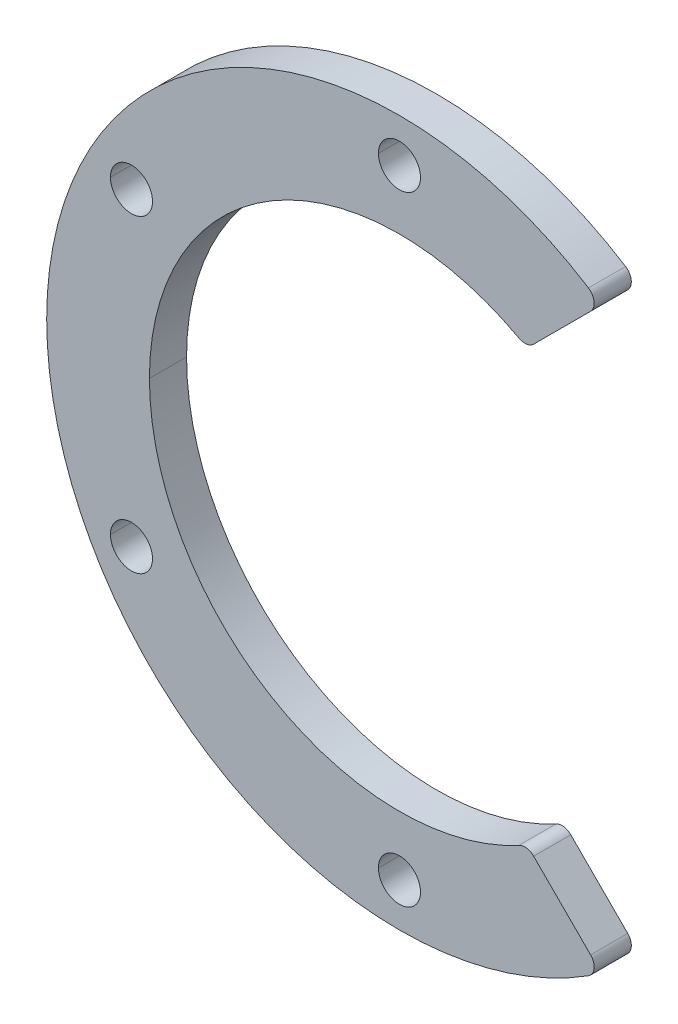
ISO-10303-21;
HEADER;
FILE_DESCRIPTION(('STEP AP214'),'2;1');
FILE_NAME('part.step','',(''),(''),'','','');
FILE_SCHEMA(('AUTOMOTIVE_DESIGN { 1 0 10303 214 1 1 1 1 }'));
ENDSEC;
DATA;
#1=APPLICATION_CONTEXT('core data for automotive mechanical design processes');
#2=APPLICATION_PROTOCOL_DEFINITION('international standard','automotive_design',2000,#1);
#3=PRODUCT_CONTEXT('',#1,'mechanical');
#4=PRODUCT('Part','Part','',(#3));
#5=PRODUCT_RELATED_PRODUCT_CATEGORY('part','',(#4));
#6=PRODUCT_DEFINITION_FORMATION('','',#4);
#7=PRODUCT_DEFINITION_CONTEXT('part definition',#1,'design');
#8=PRODUCT_DEFINITION('design','',#6,#7);
#9=PRODUCT_DEFINITION_SHAPE('','',#8);
#10=(LENGTH_UNIT() NAMED_UNIT(*) SI_UNIT(.MILLI.,.METRE.));
#11=(NAMED_UNIT(*) PLANE_ANGLE_UNIT() SI_UNIT($,.RADIAN.));
#12=(NAMED_UNIT(*) SI_UNIT($,.STERADIAN.) SOLID_ANGLE_UNIT());
#13=UNCERTAINTY_MEASURE_WITH_UNIT(LENGTH_MEASURE(1.E-05),#10,'distance_accuracy_value','');
#14=(GEOMETRIC_REPRESENTATION_CONTEXT(3) GLOBAL_UNCERTAINTY_ASSIGNED_CONTEXT((#13)) GLOBAL_UNIT_ASSIGNED_CONTEXT((#10,
#11,#12)) REPRESENTATION_CONTEXT('',''));
#15=CARTESIAN_POINT('',(0.,0.,0.));
#16=DIRECTION('',(0.,0.,1.));
#17=DIRECTION('',(1.,0.,0.));
#18=AXIS2_PLACEMENT_3D('',#15,#16,#17);
#19=CARTESIAN_POINT('',(10.1351199173702,-18.6204012916088,3.));
#20=DIRECTION('',(0.,0.,-1.));
#21=DIRECTION('',(-1.,0.,0.));
#22=AXIS2_PLACEMENT_3D('',#19,#20,#21);
#23=CYLINDRICAL_SURFACE('',#22,1.);
#24=CARTESIAN_POINT('',(10.1351199173702,-18.6204012916088,3.));
#25=DIRECTION('',(0.,0.,1.));
#26=DIRECTION('',(1.,0.,0.));
#27=AXIS2_PLACEMENT_3D('',#24,#25,#26);
#28=CIRCLE('',#27,1.);
#29=CARTESIAN_POINT('',(10.8422266985567,-17.9132945104223,3.));
#30=VERTEX_POINT('',#29);
#31=CARTESIAN_POINT('',(9.65704822315463,-17.7420804759669,3.));
#32=VERTEX_POINT('',#31);
#33=EDGE_CURVE('E219',#30,#32,#28,.T.);
#34=ORIENTED_EDGE('',*,*,#33,.F.);
#35=DIRECTION('',(0.,0.,1.));
#36=VECTOR('',#35,1.);
#37=CARTESIAN_POINT('',(10.8422266985567,-17.9132945104223,3.));
#38=LINE('',#37,#36);
#39=CARTESIAN_POINT('',(10.8422266985567,-17.9132945104223,0.));
#40=VERTEX_POINT('',#39);
#41=EDGE_CURVE('E195',#40,#30,#38,.T.);
#42=ORIENTED_EDGE('',*,*,#41,.F.);
#43=CARTESIAN_POINT('',(10.1351199173702,-18.6204012916088,0.));
#44=DIRECTION('',(0.,0.,-1.));
#45=DIRECTION('',(1.,0.,0.));
#46=AXIS2_PLACEMENT_3D('',#43,#44,#45);
#47=CIRCLE('',#46,1.);
#48=CARTESIAN_POINT('',(9.65704822315463,-17.7420804759669,0.));
#49=VERTEX_POINT('',#48);
#50=EDGE_CURVE('E23',#49,#40,#47,.T.);
#51=ORIENTED_EDGE('',*,*,#50,.F.);
#52=DIRECTION('',(0.,0.,-1.));
#53=VECTOR('',#52,1.);
#54=CARTESIAN_POINT('',(9.65704822315463,-17.7420804759669,3.));
#55=LINE('',#54,#53);
#56=EDGE_CURVE('E317',#32,#49,#55,.T.);
#57=ORIENTED_EDGE('',*,*,#56,.F.);
#58=EDGE_LOOP('',(#34,#42,#51,#57));
#59=FACE_BOUND('',#58,.T.);
#60=ADVANCED_FACE('F15',(#59),#23,.T.);
#61=CARTESIAN_POINT('',(14.734319027229,-23.2196004014676,3.));
#62=DIRECTION('',(0.,0.,-1.));
#63=DIRECTION('',(-1.,0.,0.));
#64=AXIS2_PLACEMENT_3D('',#61,#62,#63);
#65=CYLINDRICAL_SURFACE('',#64,1.);
#66=CARTESIAN_POINT('',(14.734319027229,-23.2196004014676,3.));
#67=DIRECTION('',(0.,0.,1.));
#68=DIRECTION('',(1.,0.,0.));
#69=AXIS2_PLACEMENT_3D('',#66,#67,#68);
#70=CIRCLE('',#69,1.);
#71=CARTESIAN_POINT('',(15.270112446401,-24.0639495069756,3.));
#72=VERTEX_POINT('',#71);
#73=CARTESIAN_POINT('',(15.4414258084156,-22.5124936202811,3.));
#74=VERTEX_POINT('',#73);
#75=EDGE_CURVE('E359',#72,#74,#70,.T.);
#76=ORIENTED_EDGE('',*,*,#75,.F.);
#77=DIRECTION('',(0.,0.,1.));
#78=VECTOR('',#77,1.);
#79=CARTESIAN_POINT('',(15.270112446401,-24.0639495069756,3.));
#80=LINE('',#79,#78);
#81=CARTESIAN_POINT('',(15.270112446401,-24.0639495069756,0.));
#82=VERTEX_POINT('',#81);
#83=EDGE_CURVE('E279',#82,#72,#80,.T.);
#84=ORIENTED_EDGE('',*,*,#83,.F.);
#85=CARTESIAN_POINT('',(14.734319027229,-23.2196004014676,0.));
#86=DIRECTION('',(0.,0.,-1.));
#87=DIRECTION('',(1.,0.,0.));
#88=AXIS2_PLACEMENT_3D('',#85,#86,#87);
#89=CIRCLE('',#88,1.);
#90=CARTESIAN_POINT('',(15.4414258084156,-22.5124936202811,0.));
#91=VERTEX_POINT('',#90);
#92=EDGE_CURVE('E9',#91,#82,#89,.T.);
#93=ORIENTED_EDGE('',*,*,#92,.F.);
#94=DIRECTION('',(0.,0.,-1.));
#95=VECTOR('',#94,1.);
#96=CARTESIAN_POINT('',(15.4414258084156,-22.5124936202811,3.));
#97=LINE('',#96,#95);
#98=EDGE_CURVE('E365',#74,#91,#97,.T.);
#99=ORIENTED_EDGE('',*,*,#98,.F.);
#100=EDGE_LOOP('',(#76,#84,#93,#99));
#101=FACE_BOUND('',#100,.T.);
#102=ADVANCED_FACE('F404',(#101),#65,.T.);
#103=CARTESIAN_POINT('',(10.1351199173702,18.6204012916088,3.));
#104=DIRECTION('',(0.,0.,-1.));
#105=DIRECTION('',(-1.,0.,0.));
#106=AXIS2_PLACEMENT_3D('',#103,#104,#105);
#107=CYLINDRICAL_SURFACE('',#106,1.);
#108=CARTESIAN_POINT('',(10.1351199173702,18.6204012916088,3.));
#109=DIRECTION('',(0.,0.,1.));
#110=DIRECTION('',(1.,0.,0.));
#111=AXIS2_PLACEMENT_3D('',#108,#109,#110);
#112=CIRCLE('',#111,1.);
#113=CARTESIAN_POINT('',(9.65704822315463,17.7420804759669,3.));
#114=VERTEX_POINT('',#113);
#115=CARTESIAN_POINT('',(10.8422266985567,17.9132945104223,3.));
#116=VERTEX_POINT('',#115);
#117=EDGE_CURVE('E216',#114,#116,#112,.T.);
#118=ORIENTED_EDGE('',*,*,#117,.F.);
#119=DIRECTION('',(0.,0.,1.));
#120=VECTOR('',#119,1.);
#121=CARTESIAN_POINT('',(9.65704822315463,17.7420804759669,3.));
#122=LINE('',#121,#120);
#123=CARTESIAN_POINT('',(9.65704822315463,17.7420804759669,0.));
#124=VERTEX_POINT('',#123);
#125=EDGE_CURVE('E309',#124,#114,#122,.T.);
#126=ORIENTED_EDGE('',*,*,#125,.F.);
#127=CARTESIAN_POINT('',(10.1351199173702,18.6204012916088,0.));
#128=DIRECTION('',(0.,0.,-1.));
#129=DIRECTION('',(1.,0.,0.));
#130=AXIS2_PLACEMENT_3D('',#127,#128,#129);
#131=CIRCLE('',#130,1.);
#132=CARTESIAN_POINT('',(10.8422266985567,17.9132945104223,0.));
#133=VERTEX_POINT('',#132);
#134=EDGE_CURVE('E344',#133,#124,#131,.T.);
#135=ORIENTED_EDGE('',*,*,#134,.F.);
#136=DIRECTION('',(0.,0.,-1.));
#137=VECTOR('',#136,1.);
#138=CARTESIAN_POINT('',(10.8422266985567,17.9132945104223,3.));
#139=LINE('',#138,#137);
#140=EDGE_CURVE('E301',#116,#133,#139,.T.);
#141=ORIENTED_EDGE('',*,*,#140,.F.);
#142=EDGE_LOOP('',(#118,#126,#135,#141));
#143=FACE_BOUND('',#142,.T.);
#144=ADVANCED_FACE('F391',(#143),#107,.T.);
#145=CARTESIAN_POINT('',(14.734319027229,23.2196004014676,3.));
#146=DIRECTION('',(0.,0.,-1.));
#147=DIRECTION('',(-1.,0.,0.));
#148=AXIS2_PLACEMENT_3D('',#145,#146,#147);
#149=CYLINDRICAL_SURFACE('',#148,1.);
#150=CARTESIAN_POINT('',(14.734319027229,23.2196004014676,3.));
#151=DIRECTION('',(0.,0.,1.));
#152=DIRECTION('',(1.,0.,0.));
#153=AXIS2_PLACEMENT_3D('',#150,#151,#152);
#154=CIRCLE('',#153,1.);
#155=CARTESIAN_POINT('',(15.4414258084156,22.5124936202811,3.));
#156=VERTEX_POINT('',#155);
#157=CARTESIAN_POINT('',(15.270112446401,24.0639495069756,3.));
#158=VERTEX_POINT('',#157);
#159=EDGE_CURVE('E356',#156,#158,#154,.T.);
#160=ORIENTED_EDGE('',*,*,#159,.F.);
#161=DIRECTION('',(0.,0.,1.));
#162=VECTOR('',#161,1.);
#163=CARTESIAN_POINT('',(15.4414258084156,22.5124936202811,3.));
#164=LINE('',#163,#162);
#165=CARTESIAN_POINT('',(15.4414258084156,22.5124936202811,0.));
#166=VERTEX_POINT('',#165);
#167=EDGE_CURVE('E302',#166,#156,#164,.T.);
#168=ORIENTED_EDGE('',*,*,#167,.F.);
#169=CARTESIAN_POINT('',(14.734319027229,23.2196004014676,0.));
#170=DIRECTION('',(0.,0.,-1.));
#171=DIRECTION('',(1.,0.,0.));
#172=AXIS2_PLACEMENT_3D('',#169,#170,#171);
#173=CIRCLE('',#172,1.);
#174=CARTESIAN_POINT('',(15.270112446401,24.0639495069756,0.));
#175=VERTEX_POINT('',#174);
#176=EDGE_CURVE('E218',#175,#166,#173,.T.);
#177=ORIENTED_EDGE('',*,*,#176,.F.);
#178=DIRECTION('',(0.,0.,-1.));
#179=VECTOR('',#178,1.);
#180=CARTESIAN_POINT('',(15.270112446401,24.0639495069756,3.));
#181=LINE('',#180,#179);
#182=EDGE_CURVE('E337',#158,#175,#181,.T.);
#183=ORIENTED_EDGE('',*,*,#182,.F.);
#184=EDGE_LOOP('',(#160,#168,#177,#183));
#185=FACE_BOUND('',#184,.T.);
#186=ADVANCED_FACE('F415',(#185),#149,.T.);
#187=CARTESIAN_POINT('',(0.,0.,0.));
#188=DIRECTION('',(0.,0.,1.));
#189=DIRECTION('',(1.,0.,0.));
#190=AXIS2_PLACEMENT_3D('',#187,#188,#189);
#191=PLANE('',#190);
#192=CARTESIAN_POINT('',(-1.6614739120108E-13,25.,0.));
#193=DIRECTION('',(0.,0.,1.));
#194=DIRECTION('',(1.,0.,0.));
#195=AXIS2_PLACEMENT_3D('',#192,#193,#194);
#196=CIRCLE('',#195,1.7);
#197=CARTESIAN_POINT('',(-1.70000000000016,25.,0.));
#198=VERTEX_POINT('',#197);
#199=CARTESIAN_POINT('',(1.69999999999983,25.,0.));
#200=VERTEX_POINT('',#199);
#201=EDGE_CURVE('E201',#198,#200,#196,.T.);
#202=ORIENTED_EDGE('',*,*,#201,.T.);
#203=CARTESIAN_POINT('',(-1.6614739120108E-13,25.,0.));
#204=DIRECTION('',(0.,0.,1.));
#205=DIRECTION('',(1.,0.,0.));
#206=AXIS2_PLACEMENT_3D('',#203,#204,#205);
#207=CIRCLE('',#206,1.7);
#208=EDGE_CURVE('E194',#200,#198,#207,.T.);
#209=ORIENTED_EDGE('',*,*,#208,.T.);
#210=EDGE_LOOP('',(#202,#209));
#211=FACE_BOUND('',#210,.T.);
#212=CARTESIAN_POINT('',(1.6614739120108E-13,-25.,0.));
#213=DIRECTION('',(0.,0.,1.));
#214=DIRECTION('',(1.,0.,0.));
#215=AXIS2_PLACEMENT_3D('',#212,#213,#214);
#216=CIRCLE('',#215,1.7);
#217=CARTESIAN_POINT('',(-1.69999999999983,-25.,0.));
#218=VERTEX_POINT('',#217);
#219=CARTESIAN_POINT('',(1.70000000000016,-25.,0.));
#220=VERTEX_POINT('',#219);
#221=EDGE_CURVE('E221',#218,#220,#216,.T.);
#222=ORIENTED_EDGE('',*,*,#221,.T.);
#223=CARTESIAN_POINT('',(1.6614739120108E-13,-25.,0.));
#224=DIRECTION('',(0.,0.,1.));
#225=DIRECTION('',(1.,0.,0.));
#226=AXIS2_PLACEMENT_3D('',#223,#224,#225);
#227=CIRCLE('',#226,1.7);
#228=EDGE_CURVE('E350',#220,#218,#227,.T.);
#229=ORIENTED_EDGE('',*,*,#228,.T.);
#230=EDGE_LOOP('',(#222,#229));
#231=FACE_BOUND('',#230,.T.);
#232=CARTESIAN_POINT('',(-21.650635094611,12.5,0.));
#233=DIRECTION('',(0.,0.,1.));
#234=DIRECTION('',(1.,0.,0.));
#235=AXIS2_PLACEMENT_3D('',#232,#233,#234);
#236=CIRCLE('',#235,1.7);
#237=CARTESIAN_POINT('',(-23.350635094611,12.5,0.));
#238=VERTEX_POINT('',#237);
#239=CARTESIAN_POINT('',(-19.950635094611,12.5,0.));
#240=VERTEX_POINT('',#239);
#241=EDGE_CURVE('E269',#238,#240,#236,.T.);
#242=ORIENTED_EDGE('',*,*,#241,.T.);
#243=CARTESIAN_POINT('',(-21.650635094611,12.5,0.));
#244=DIRECTION('',(0.,0.,1.));
#245=DIRECTION('',(1.,0.,0.));
#246=AXIS2_PLACEMENT_3D('',#243,#244,#245);
#247=CIRCLE('',#246,1.7);
#248=EDGE_CURVE('E246',#240,#238,#247,.T.);
#249=ORIENTED_EDGE('',*,*,#248,.T.);
#250=EDGE_LOOP('',(#242,#249));
#251=FACE_BOUND('',#250,.T.);
#252=CARTESIAN_POINT('',(-21.6506350946109,-12.5,0.));
#253=DIRECTION('',(0.,0.,1.));
#254=DIRECTION('',(1.,0.,0.));
#255=AXIS2_PLACEMENT_3D('',#252,#253,#254);
#256=CIRCLE('',#255,1.7);
#257=CARTESIAN_POINT('',(-23.3506350946109,-12.5,0.));
#258=VERTEX_POINT('',#257);
#259=CARTESIAN_POINT('',(-19.9506350946109,-12.5,0.));
#260=VERTEX_POINT('',#259);
#261=EDGE_CURVE('E229',#258,#260,#256,.T.);
#262=ORIENTED_EDGE('',*,*,#261,.T.);
#263=CARTESIAN_POINT('',(-21.6506350946109,-12.5,0.));
#264=DIRECTION('',(0.,0.,1.));
#265=DIRECTION('',(1.,0.,0.));
#266=AXIS2_PLACEMENT_3D('',#263,#264,#265);
#267=CIRCLE('',#266,1.7);
#268=EDGE_CURVE('E245',#260,#258,#267,.T.);
#269=ORIENTED_EDGE('',*,*,#268,.T.);
#270=EDGE_LOOP('',(#262,#269));
#271=FACE_BOUND('',#270,.T.);
#272=CARTESIAN_POINT('',(0.,0.,0.));
#273=DIRECTION('',(0.,0.,1.));
#274=DIRECTION('',(1.,0.,0.));
#275=AXIS2_PLACEMENT_3D('',#272,#273,#274);
#276=CIRCLE('',#275,28.5);
#277=CARTESIAN_POINT('',(-28.5,0.,0.));
#278=VERTEX_POINT('',#277);
#279=EDGE_CURVE('E341',#175,#278,#276,.T.);
#280=ORIENTED_EDGE('',*,*,#279,.F.);
#281=ORIENTED_EDGE('',*,*,#176,.T.);
#282=DIRECTION('',(-0.707106781186546,-0.707106781186549,0.));
#283=VECTOR('',#282,1.);
#284=CARTESIAN_POINT('',(-3.53553390593274,3.53553390593274,0.));
#285=LINE('',#284,#283);
#286=EDGE_CURVE('E324',#166,#133,#285,.T.);
#287=ORIENTED_EDGE('',*,*,#286,.T.);
#288=ORIENTED_EDGE('',*,*,#134,.T.);
#289=CARTESIAN_POINT('',(0.,0.,0.));
#290=DIRECTION('',(0.,0.,1.));
#291=DIRECTION('',(1.,0.,0.));
#292=AXIS2_PLACEMENT_3D('',#289,#290,#291);
#293=CIRCLE('',#292,20.2000000000005);
#294=CARTESIAN_POINT('',(-20.2000000000005,0.,0.));
#295=VERTEX_POINT('',#294);
#296=EDGE_CURVE('E274',#124,#295,#293,.T.);
#297=ORIENTED_EDGE('',*,*,#296,.T.);
#298=CARTESIAN_POINT('',(0.,0.,0.));
#299=DIRECTION('',(0.,0.,1.));
#300=DIRECTION('',(1.,0.,0.));
#301=AXIS2_PLACEMENT_3D('',#298,#299,#300);
#302=CIRCLE('',#301,20.2000000000005);
#303=EDGE_CURVE('E321',#295,#49,#302,.T.);
#304=ORIENTED_EDGE('',*,*,#303,.T.);
#305=ORIENTED_EDGE('',*,*,#50,.T.);
#306=DIRECTION('',(-0.707106781186546,0.707106781186549,0.));
#307=VECTOR('',#306,1.);
#308=CARTESIAN_POINT('',(-3.53553390593274,-3.53553390593274,0.));
#309=LINE('',#308,#307);
#310=EDGE_CURVE('E241',#91,#40,#309,.T.);
#311=ORIENTED_EDGE('',*,*,#310,.F.);
#312=ORIENTED_EDGE('',*,*,#92,.T.);
#313=CARTESIAN_POINT('',(0.,0.,0.));
#314=DIRECTION('',(0.,0.,1.));
#315=DIRECTION('',(1.,0.,0.));
#316=AXIS2_PLACEMENT_3D('',#313,#314,#315);
#317=CIRCLE('',#316,28.5);
#318=EDGE_CURVE('E293',#278,#82,#317,.T.);
#319=ORIENTED_EDGE('',*,*,#318,.F.);
#320=EDGE_LOOP('',(#280,#281,#287,#288,#297,#304,#305,#311,#312,#319));
#321=FACE_BOUND('',#320,.T.);
#322=ADVANCED_FACE('F386',(#211,#231,#251,#271,#321),#191,.F.);
#323=CARTESIAN_POINT('',(0.,0.,3.));
#324=DIRECTION('',(0.,0.,1.));
#325=DIRECTION('',(1.,0.,0.));
#326=AXIS2_PLACEMENT_3D('',#323,#324,#325);
#327=PLANE('',#326);
#328=CARTESIAN_POINT('',(-1.6614739120108E-13,25.,3.));
#329=DIRECTION('',(0.,0.,1.));
#330=DIRECTION('',(1.,0.,0.));
#331=AXIS2_PLACEMENT_3D('',#328,#329,#330);
#332=CIRCLE('',#331,1.7);
#333=CARTESIAN_POINT('',(-1.70000000000016,25.,3.));
#334=VERTEX_POINT('',#333);
#335=CARTESIAN_POINT('',(1.69999999999983,25.,3.));
#336=VERTEX_POINT('',#335);
#337=EDGE_CURVE('E199',#334,#336,#332,.T.);
#338=ORIENTED_EDGE('',*,*,#337,.F.);
#339=CARTESIAN_POINT('',(-1.6614739120108E-13,25.,3.));
#340=DIRECTION('',(0.,0.,1.));
#341=DIRECTION('',(1.,0.,0.));
#342=AXIS2_PLACEMENT_3D('',#339,#340,#341);
#343=CIRCLE('',#342,1.7);
#344=EDGE_CURVE('E183',#336,#334,#343,.T.);
#345=ORIENTED_EDGE('',*,*,#344,.F.);
#346=EDGE_LOOP('',(#338,#345));
#347=FACE_BOUND('',#346,.T.);
#348=CARTESIAN_POINT('',(1.6614739120108E-13,-25.,3.));
#349=DIRECTION('',(0.,0.,1.));
#350=DIRECTION('',(1.,0.,0.));
#351=AXIS2_PLACEMENT_3D('',#348,#349,#350);
#352=CIRCLE('',#351,1.7);
#353=CARTESIAN_POINT('',(-1.69999999999983,-25.,3.));
#354=VERTEX_POINT('',#353);
#355=CARTESIAN_POINT('',(1.70000000000016,-25.,3.));
#356=VERTEX_POINT('',#355);
#357=EDGE_CURVE('E283',#354,#356,#352,.T.);
#358=ORIENTED_EDGE('',*,*,#357,.F.);
#359=CARTESIAN_POINT('',(1.6614739120108E-13,-25.,3.));
#360=DIRECTION('',(0.,0.,1.));
#361=DIRECTION('',(1.,0.,0.));
#362=AXIS2_PLACEMENT_3D('',#359,#360,#361);
#363=CIRCLE('',#362,1.7);
#364=EDGE_CURVE('E347',#356,#354,#363,.T.);
#365=ORIENTED_EDGE('',*,*,#364,.F.);
#366=EDGE_LOOP('',(#358,#365));
#367=FACE_BOUND('',#366,.T.);
#368=CARTESIAN_POINT('',(-21.650635094611,12.5,3.));
#369=DIRECTION('',(0.,0.,1.));
#370=DIRECTION('',(1.,0.,0.));
#371=AXIS2_PLACEMENT_3D('',#368,#369,#370);
#372=CIRCLE('',#371,1.7);
#373=CARTESIAN_POINT('',(-23.350635094611,12.5,3.));
#374=VERTEX_POINT('',#373);
#375=CARTESIAN_POINT('',(-19.950635094611,12.5,3.));
#376=VERTEX_POINT('',#375);
#377=EDGE_CURVE('E261',#374,#376,#372,.T.);
#378=ORIENTED_EDGE('',*,*,#377,.F.);
#379=CARTESIAN_POINT('',(-21.650635094611,12.5,3.));
#380=DIRECTION('',(0.,0.,1.));
#381=DIRECTION('',(1.,0.,0.));
#382=AXIS2_PLACEMENT_3D('',#379,#380,#381);
#383=CIRCLE('',#382,1.7);
#384=EDGE_CURVE('E353',#376,#374,#383,.T.);
#385=ORIENTED_EDGE('',*,*,#384,.F.);
#386=EDGE_LOOP('',(#378,#385));
#387=FACE_BOUND('',#386,.T.);
#388=CARTESIAN_POINT('',(-21.6506350946109,-12.5,3.));
#389=DIRECTION('',(0.,0.,1.));
#390=DIRECTION('',(1.,0.,0.));
#391=AXIS2_PLACEMENT_3D('',#388,#389,#390);
#392=CIRCLE('',#391,1.7);
#393=CARTESIAN_POINT('',(-23.3506350946109,-12.5,3.));
#394=VERTEX_POINT('',#393);
#395=CARTESIAN_POINT('',(-19.9506350946109,-12.5,3.));
#396=VERTEX_POINT('',#395);
#397=EDGE_CURVE('E203',#394,#396,#392,.T.);
#398=ORIENTED_EDGE('',*,*,#397,.F.);
#399=CARTESIAN_POINT('',(-21.6506350946109,-12.5,3.));
#400=DIRECTION('',(0.,0.,1.));
#401=DIRECTION('',(1.,0.,0.));
#402=AXIS2_PLACEMENT_3D('',#399,#400,#401);
#403=CIRCLE('',#402,1.7);
#404=EDGE_CURVE('E242',#396,#394,#403,.T.);
#405=ORIENTED_EDGE('',*,*,#404,.F.);
#406=EDGE_LOOP('',(#398,#405));
#407=FACE_BOUND('',#406,.T.);
#408=DIRECTION('',(-0.707106781186546,-0.707106781186549,0.));
#409=VECTOR('',#408,1.);
#410=CARTESIAN_POINT('',(-3.53553390593274,3.53553390593274,3.));
#411=LINE('',#410,#409);
#412=EDGE_CURVE('E297',#156,#116,#411,.T.);
#413=ORIENTED_EDGE('',*,*,#412,.F.);
#414=ORIENTED_EDGE('',*,*,#159,.T.);
#415=CARTESIAN_POINT('',(0.,0.,3.));
#416=DIRECTION('',(0.,0.,1.));
#417=DIRECTION('',(1.,0.,0.));
#418=AXIS2_PLACEMENT_3D('',#415,#416,#417);
#419=CIRCLE('',#418,28.5);
#420=CARTESIAN_POINT('',(-28.5,0.,3.));
#421=VERTEX_POINT('',#420);
#422=EDGE_CURVE('E334',#158,#421,#419,.T.);
#423=ORIENTED_EDGE('',*,*,#422,.T.);
#424=CARTESIAN_POINT('',(0.,0.,3.));
#425=DIRECTION('',(0.,0.,1.));
#426=DIRECTION('',(1.,0.,0.));
#427=AXIS2_PLACEMENT_3D('',#424,#425,#426);
#428=CIRCLE('',#427,28.5);
#429=EDGE_CURVE('E250',#421,#72,#428,.T.);
#430=ORIENTED_EDGE('',*,*,#429,.T.);
#431=ORIENTED_EDGE('',*,*,#75,.T.);
#432=DIRECTION('',(-0.707106781186546,0.707106781186549,0.));
#433=VECTOR('',#432,1.);
#434=CARTESIAN_POINT('',(-3.53553390593274,-3.53553390593274,3.));
#435=LINE('',#434,#433);
#436=EDGE_CURVE('E368',#74,#30,#435,.T.);
#437=ORIENTED_EDGE('',*,*,#436,.T.);
#438=ORIENTED_EDGE('',*,*,#33,.T.);
#439=CARTESIAN_POINT('',(0.,0.,3.));
#440=DIRECTION('',(0.,0.,1.));
#441=DIRECTION('',(1.,0.,0.));
#442=AXIS2_PLACEMENT_3D('',#439,#440,#441);
#443=CIRCLE('',#442,20.2000000000005);
#444=CARTESIAN_POINT('',(-20.2000000000005,0.,3.));
#445=VERTEX_POINT('',#444);
#446=EDGE_CURVE('E313',#445,#32,#443,.T.);
#447=ORIENTED_EDGE('',*,*,#446,.F.);
#448=CARTESIAN_POINT('',(0.,0.,3.));
#449=DIRECTION('',(0.,0.,1.));
#450=DIRECTION('',(1.,0.,0.));
#451=AXIS2_PLACEMENT_3D('',#448,#449,#450);
#452=CIRCLE('',#451,20.2000000000005);
#453=EDGE_CURVE('E275',#114,#445,#452,.T.);
#454=ORIENTED_EDGE('',*,*,#453,.F.);
#455=ORIENTED_EDGE('',*,*,#117,.T.);
#456=EDGE_LOOP('',(#413,#414,#423,#430,#431,#437,#438,#447,#454,#455));
#457=FACE_BOUND('',#456,.T.);
#458=ADVANCED_FACE('F205',(#347,#367,#387,#407,#457),#327,.T.);
#459=CARTESIAN_POINT('',(-1.6614739120108E-13,25.,3.));
#460=DIRECTION('',(0.,0.,-1.));
#461=DIRECTION('',(-1.,0.,0.));
#462=AXIS2_PLACEMENT_3D('',#459,#460,#461);
#463=CYLINDRICAL_SURFACE('',#462,1.7);
#464=DIRECTION('',(0.,0.,-1.));
#465=VECTOR('',#464,1.);
#466=CARTESIAN_POINT('',(1.69999999999983,25.,3.));
#467=LINE('',#466,#465);
#468=EDGE_CURVE('E189',#336,#200,#467,.T.);
#469=ORIENTED_EDGE('',*,*,#468,.F.);
#470=ORIENTED_EDGE('',*,*,#344,.T.);
#471=DIRECTION('',(0.,0.,-1.));
#472=VECTOR('',#471,1.);
#473=CARTESIAN_POINT('',(-1.70000000000016,25.,3.));
#474=LINE('',#473,#472);
#475=EDGE_CURVE('E186',#334,#198,#474,.T.);
#476=ORIENTED_EDGE('',*,*,#475,.T.);
#477=ORIENTED_EDGE('',*,*,#208,.F.);
#478=EDGE_LOOP('',(#469,#470,#476,#477));
#479=FACE_BOUND('',#478,.T.);
#480=ADVANCED_FACE('F185',(#479),#463,.F.);
#481=CARTESIAN_POINT('',(-3.53553390593274,-3.53553390593274,3.));
#482=DIRECTION('',(-0.707106781186549,-0.707106781186546,0.));
#483=DIRECTION('',(-0.707106781186546,0.707106781186549,0.));
#484=AXIS2_PLACEMENT_3D('',#481,#482,#483);
#485=PLANE('',#484);
#486=ORIENTED_EDGE('',*,*,#436,.F.);
#487=ORIENTED_EDGE('',*,*,#98,.T.);
#488=ORIENTED_EDGE('',*,*,#310,.T.);
#489=ORIENTED_EDGE('',*,*,#41,.T.);
#490=EDGE_LOOP('',(#486,#487,#488,#489));
#491=FACE_BOUND('',#490,.T.);
#492=ADVANCED_FACE('F402',(#491),#485,.F.);
#493=CARTESIAN_POINT('',(-21.6506350946109,-12.5,3.));
#494=DIRECTION('',(0.,0.,-1.));
#495=DIRECTION('',(-1.,0.,0.));
#496=AXIS2_PLACEMENT_3D('',#493,#494,#495);
#497=CYLINDRICAL_SURFACE('',#496,1.7);
#498=DIRECTION('',(0.,0.,-1.));
#499=VECTOR('',#498,1.);
#500=CARTESIAN_POINT('',(-19.9506350946109,-12.5,3.));
#501=LINE('',#500,#499);
#502=EDGE_CURVE('E233',#396,#260,#501,.T.);
#503=ORIENTED_EDGE('',*,*,#502,.F.);
#504=ORIENTED_EDGE('',*,*,#404,.T.);
#505=DIRECTION('',(0.,0.,-1.));
#506=VECTOR('',#505,1.);
#507=CARTESIAN_POINT('',(-23.3506350946109,-12.5,3.));
#508=LINE('',#507,#506);
#509=EDGE_CURVE('E232',#394,#258,#508,.T.);
#510=ORIENTED_EDGE('',*,*,#509,.T.);
#511=ORIENTED_EDGE('',*,*,#268,.F.);
#512=EDGE_LOOP('',(#503,#504,#510,#511));
#513=FACE_BOUND('',#512,.T.);
#514=ADVANCED_FACE('F479',(#513),#497,.F.);
#515=CARTESIAN_POINT('',(-21.650635094611,12.5,3.));
#516=DIRECTION('',(0.,0.,-1.));
#517=DIRECTION('',(-1.,0.,0.));
#518=AXIS2_PLACEMENT_3D('',#515,#516,#517);
#519=CYLINDRICAL_SURFACE('',#518,1.7);
#520=DIRECTION('',(0.,0.,-1.));
#521=VECTOR('',#520,1.);
#522=CARTESIAN_POINT('',(-19.950635094611,12.5,3.));
#523=LINE('',#522,#521);
#524=EDGE_CURVE('E265',#376,#240,#523,.T.);
#525=ORIENTED_EDGE('',*,*,#524,.F.);
#526=ORIENTED_EDGE('',*,*,#384,.T.);
#527=DIRECTION('',(0.,0.,-1.));
#528=VECTOR('',#527,1.);
#529=CARTESIAN_POINT('',(-23.350635094611,12.5,3.));
#530=LINE('',#529,#528);
#531=EDGE_CURVE('E215',#374,#238,#530,.T.);
#532=ORIENTED_EDGE('',*,*,#531,.T.);
#533=ORIENTED_EDGE('',*,*,#248,.F.);
#534=EDGE_LOOP('',(#525,#526,#532,#533));
#535=FACE_BOUND('',#534,.T.);
#536=ADVANCED_FACE('F490',(#535),#519,.F.);
#537=CARTESIAN_POINT('',(1.6614739120108E-13,-25.,3.));
#538=DIRECTION('',(0.,0.,-1.));
#539=DIRECTION('',(-1.,0.,0.));
#540=AXIS2_PLACEMENT_3D('',#537,#538,#539);
#541=CYLINDRICAL_SURFACE('',#540,1.7);
#542=DIRECTION('',(0.,0.,-1.));
#543=VECTOR('',#542,1.);
#544=CARTESIAN_POINT('',(1.70000000000016,-25.,3.));
#545=LINE('',#544,#543);
#546=EDGE_CURVE('E226',#356,#220,#545,.T.);
#547=ORIENTED_EDGE('',*,*,#546,.F.);
#548=ORIENTED_EDGE('',*,*,#364,.T.);
#549=DIRECTION('',(0.,0.,-1.));
#550=VECTOR('',#549,1.);
#551=CARTESIAN_POINT('',(-1.69999999999983,-25.,3.));
#552=LINE('',#551,#550);
#553=EDGE_CURVE('E225',#354,#218,#552,.T.);
#554=ORIENTED_EDGE('',*,*,#553,.T.);
#555=ORIENTED_EDGE('',*,*,#228,.F.);
#556=EDGE_LOOP('',(#547,#548,#554,#555));
#557=FACE_BOUND('',#556,.T.);
#558=ADVANCED_FACE('F502',(#557),#541,.F.);
#559=CARTESIAN_POINT('',(0.,0.,3.));
#560=DIRECTION('',(0.,0.,-1.));
#561=DIRECTION('',(-1.,0.,0.));
#562=AXIS2_PLACEMENT_3D('',#559,#560,#561);
#563=CYLINDRICAL_SURFACE('',#562,28.5);
#564=DIRECTION('',(0.,0.,-1.));
#565=VECTOR('',#564,1.);
#566=CARTESIAN_POINT('',(-28.5,0.,3.));
#567=LINE('',#566,#565);
#568=EDGE_CURVE('E254',#421,#278,#567,.T.);
#569=ORIENTED_EDGE('',*,*,#568,.F.);
#570=ORIENTED_EDGE('',*,*,#422,.F.);
#571=ORIENTED_EDGE('',*,*,#182,.T.);
#572=ORIENTED_EDGE('',*,*,#279,.T.);
#573=EDGE_LOOP('',(#569,#570,#571,#572));
#574=FACE_BOUND('',#573,.T.);
#575=ADVANCED_FACE('F411',(#574),#563,.T.);
#576=CARTESIAN_POINT('',(-3.53553390593274,3.53553390593274,3.));
#577=DIRECTION('',(0.707106781186549,-0.707106781186546,0.));
#578=DIRECTION('',(0.,0.,-1.));
#579=AXIS2_PLACEMENT_3D('',#576,#577,#578);
#580=PLANE('',#579);
#581=ORIENTED_EDGE('',*,*,#286,.F.);
#582=ORIENTED_EDGE('',*,*,#167,.T.);
#583=ORIENTED_EDGE('',*,*,#412,.T.);
#584=ORIENTED_EDGE('',*,*,#140,.T.);
#585=EDGE_LOOP('',(#581,#582,#583,#584));
#586=FACE_BOUND('',#585,.T.);
#587=ADVANCED_FACE('F418',(#586),#580,.T.);
#588=CARTESIAN_POINT('',(0.,0.,3.));
#589=DIRECTION('',(0.,0.,-1.));
#590=DIRECTION('',(-1.,0.,0.));
#591=AXIS2_PLACEMENT_3D('',#588,#589,#590);
#592=CYLINDRICAL_SURFACE('',#591,20.2000000000005);
#593=DIRECTION('',(0.,0.,-1.));
#594=VECTOR('',#593,1.);
#595=CARTESIAN_POINT('',(-20.2000000000005,0.,3.));
#596=LINE('',#595,#594);
#597=EDGE_CURVE('E270',#445,#295,#596,.T.);
#598=ORIENTED_EDGE('',*,*,#597,.F.);
#599=ORIENTED_EDGE('',*,*,#446,.T.);
#600=ORIENTED_EDGE('',*,*,#56,.T.);
#601=ORIENTED_EDGE('',*,*,#303,.F.);
#602=EDGE_LOOP('',(#598,#599,#600,#601));
#603=FACE_BOUND('',#602,.T.);
#604=ADVANCED_FACE('F397',(#603),#592,.F.);
#605=CARTESIAN_POINT('',(0.,0.,3.));
#606=DIRECTION('',(0.,0.,-1.));
#607=DIRECTION('',(-1.,0.,0.));
#608=AXIS2_PLACEMENT_3D('',#605,#606,#607);
#609=CYLINDRICAL_SURFACE('',#608,20.2000000000005);
#610=ORIENTED_EDGE('',*,*,#453,.T.);
#611=ORIENTED_EDGE('',*,*,#597,.T.);
#612=ORIENTED_EDGE('',*,*,#296,.F.);
#613=ORIENTED_EDGE('',*,*,#125,.T.);
#614=EDGE_LOOP('',(#610,#611,#612,#613));
#615=FACE_BOUND('',#614,.T.);
#616=ADVANCED_FACE('F394',(#615),#609,.F.);
#617=CARTESIAN_POINT('',(0.,0.,3.));
#618=DIRECTION('',(0.,0.,-1.));
#619=DIRECTION('',(-1.,0.,0.));
#620=AXIS2_PLACEMENT_3D('',#617,#618,#619);
#621=CYLINDRICAL_SURFACE('',#620,28.5);
#622=ORIENTED_EDGE('',*,*,#429,.F.);
#623=ORIENTED_EDGE('',*,*,#568,.T.);
#624=ORIENTED_EDGE('',*,*,#318,.T.);
#625=ORIENTED_EDGE('',*,*,#83,.T.);
#626=EDGE_LOOP('',(#622,#623,#624,#625));
#627=FACE_BOUND('',#626,.T.);
#628=ADVANCED_FACE('F407',(#627),#621,.T.);
#629=CARTESIAN_POINT('',(1.6614739120108E-13,-25.,3.));
#630=DIRECTION('',(0.,0.,-1.));
#631=DIRECTION('',(-1.,0.,0.));
#632=AXIS2_PLACEMENT_3D('',#629,#630,#631);
#633=CYLINDRICAL_SURFACE('',#632,1.7);
#634=ORIENTED_EDGE('',*,*,#357,.T.);
#635=ORIENTED_EDGE('',*,*,#546,.T.);
#636=ORIENTED_EDGE('',*,*,#221,.F.);
#637=ORIENTED_EDGE('',*,*,#553,.F.);
#638=EDGE_LOOP('',(#634,#635,#636,#637));
#639=FACE_BOUND('',#638,.T.);
#640=ADVANCED_FACE('F558',(#639),#633,.F.);
#641=CARTESIAN_POINT('',(-21.650635094611,12.5,3.));
#642=DIRECTION('',(0.,0.,-1.));
#643=DIRECTION('',(-1.,0.,0.));
#644=AXIS2_PLACEMENT_3D('',#641,#642,#643);
#645=CYLINDRICAL_SURFACE('',#644,1.7);
#646=ORIENTED_EDGE('',*,*,#377,.T.);
#647=ORIENTED_EDGE('',*,*,#524,.T.);
#648=ORIENTED_EDGE('',*,*,#241,.F.);
#649=ORIENTED_EDGE('',*,*,#531,.F.);
#650=EDGE_LOOP('',(#646,#647,#648,#649));
#651=FACE_BOUND('',#650,.T.);
#652=ADVANCED_FACE('F567',(#651),#645,.F.);
#653=CARTESIAN_POINT('',(-21.6506350946109,-12.5,3.));
#654=DIRECTION('',(0.,0.,-1.));
#655=DIRECTION('',(-1.,0.,0.));
#656=AXIS2_PLACEMENT_3D('',#653,#654,#655);
#657=CYLINDRICAL_SURFACE('',#656,1.7);
#658=ORIENTED_EDGE('',*,*,#397,.T.);
#659=ORIENTED_EDGE('',*,*,#502,.T.);
#660=ORIENTED_EDGE('',*,*,#261,.F.);
#661=ORIENTED_EDGE('',*,*,#509,.F.);
#662=EDGE_LOOP('',(#658,#659,#660,#661));
#663=FACE_BOUND('',#662,.T.);
#664=ADVANCED_FACE('F577',(#663),#657,.F.);
#665=CARTESIAN_POINT('',(-1.6614739120108E-13,25.,3.));
#666=DIRECTION('',(0.,0.,-1.));
#667=DIRECTION('',(-1.,0.,0.));
#668=AXIS2_PLACEMENT_3D('',#665,#666,#667);
#669=CYLINDRICAL_SURFACE('',#668,1.7);
#670=ORIENTED_EDGE('',*,*,#337,.T.);
#671=ORIENTED_EDGE('',*,*,#468,.T.);
#672=ORIENTED_EDGE('',*,*,#201,.F.);
#673=ORIENTED_EDGE('',*,*,#475,.F.);
#674=EDGE_LOOP('',(#670,#671,#672,#673));
#675=FACE_BOUND('',#674,.T.);
#676=ADVANCED_FACE('F198',(#675),#669,.F.);
#677=CLOSED_SHELL('',(#60,#102,#144,#186,#322,#458,#480,#492,#514,#536,#558,#575,#587,#604,#616,
#628,#640,#652,#664,#676));
#678=MANIFOLD_SOLID_BREP('B1',#677);
#679=ADVANCED_BREP_SHAPE_REPRESENTATION('',(#18,#678),#14);
#680=SHAPE_DEFINITION_REPRESENTATION(#9,#679);
ENDSEC;
END-ISO-10303-21;
